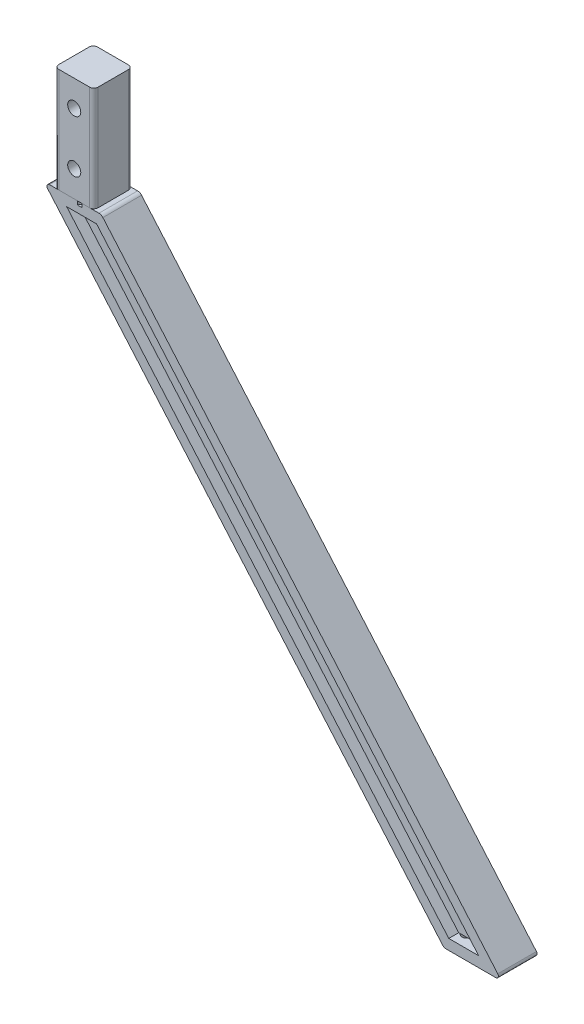
ISO-10303-21;
HEADER;
FILE_DESCRIPTION(('STEP AP214'),'2;1');
FILE_NAME('part.step','',(''),(''),'','','');
FILE_SCHEMA(('AUTOMOTIVE_DESIGN { 1 0 10303 214 1 1 1 1 }'));
ENDSEC;
DATA;
#1=APPLICATION_CONTEXT('core data for automotive mechanical design processes');
#2=APPLICATION_PROTOCOL_DEFINITION('international standard','automotive_design',2000,#1);
#3=PRODUCT_CONTEXT('',#1,'mechanical');
#4=PRODUCT('Part','Part','',(#3));
#5=PRODUCT_RELATED_PRODUCT_CATEGORY('part','',(#4));
#6=PRODUCT_DEFINITION_FORMATION('','',#4);
#7=PRODUCT_DEFINITION_CONTEXT('part definition',#1,'design');
#8=PRODUCT_DEFINITION('design','',#6,#7);
#9=PRODUCT_DEFINITION_SHAPE('','',#8);
#10=(LENGTH_UNIT() NAMED_UNIT(*) SI_UNIT(.MILLI.,.METRE.));
#11=(NAMED_UNIT(*) PLANE_ANGLE_UNIT() SI_UNIT($,.RADIAN.));
#12=(NAMED_UNIT(*) SI_UNIT($,.STERADIAN.) SOLID_ANGLE_UNIT());
#13=UNCERTAINTY_MEASURE_WITH_UNIT(LENGTH_MEASURE(1.E-05),#10,'distance_accuracy_value','');
#14=(GEOMETRIC_REPRESENTATION_CONTEXT(3) GLOBAL_UNCERTAINTY_ASSIGNED_CONTEXT((#13)) GLOBAL_UNIT_ASSIGNED_CONTEXT((#10,
#11,#12)) REPRESENTATION_CONTEXT('',''));
#15=CARTESIAN_POINT('',(0.,0.,0.));
#16=DIRECTION('',(0.,0.,1.));
#17=DIRECTION('',(1.,0.,0.));
#18=AXIS2_PLACEMENT_3D('',#15,#16,#17);
#19=CARTESIAN_POINT('',(-172.203507981271,276.098,2.032));
#20=DIRECTION('',(0.,-1.,0.));
#21=DIRECTION('',(0.,0.,-1.));
#22=AXIS2_PLACEMENT_3D('',#19,#20,#21);
#23=CYLINDRICAL_SURFACE('',#22,2.032);
#24=CARTESIAN_POINT('',(-172.203507981271,225.298,2.032));
#25=DIRECTION('',(0.,1.,0.));
#26=DIRECTION('',(0.,0.,1.));
#27=AXIS2_PLACEMENT_3D('',#24,#25,#26);
#28=CIRCLE('',#27,2.032);
#29=CARTESIAN_POINT('',(-170.171507981271,225.298,2.03200000000001));
#30=VERTEX_POINT('',#29);
#31=CARTESIAN_POINT('',(-172.203507981271,225.298,0.));
#32=VERTEX_POINT('',#31);
#33=EDGE_CURVE('E145',#30,#32,#28,.T.);
#34=ORIENTED_EDGE('',*,*,#33,.T.);
#35=DIRECTION('',(0.,-1.,0.));
#36=VECTOR('',#35,1.);
#37=CARTESIAN_POINT('',(-172.203507981271,276.098,0.));
#38=LINE('',#37,#36);
#39=CARTESIAN_POINT('',(-172.203507981271,276.098,0.));
#40=VERTEX_POINT('',#39);
#41=EDGE_CURVE('E12',#40,#32,#38,.T.);
#42=ORIENTED_EDGE('',*,*,#41,.F.);
#43=CARTESIAN_POINT('',(-172.203507981271,276.098,2.032));
#44=DIRECTION('',(0.,1.,0.));
#45=DIRECTION('',(0.,0.,1.));
#46=AXIS2_PLACEMENT_3D('',#43,#44,#45);
#47=CIRCLE('',#46,2.032);
#48=CARTESIAN_POINT('',(-170.171507981271,276.098,2.03200000000001));
#49=VERTEX_POINT('',#48);
#50=EDGE_CURVE('E159',#49,#40,#47,.T.);
#51=ORIENTED_EDGE('',*,*,#50,.F.);
#52=DIRECTION('',(0.,-1.,0.));
#53=VECTOR('',#52,1.);
#54=CARTESIAN_POINT('',(-170.171507981271,276.098,2.03200000000001));
#55=LINE('',#54,#53);
#56=EDGE_CURVE('E141',#49,#30,#55,.T.);
#57=ORIENTED_EDGE('',*,*,#56,.T.);
#58=EDGE_LOOP('',(#34,#42,#51,#57));
#59=FACE_BOUND('',#58,.T.);
#60=ADVANCED_FACE('F47',(#59),#23,.T.);
#61=CARTESIAN_POINT('',(-187.189507981271,276.098,0.));
#62=DIRECTION('',(0.,0.,1.));
#63=DIRECTION('',(1.,0.,0.));
#64=AXIS2_PLACEMENT_3D('',#61,#62,#63);
#65=PLANE('',#64);
#66=CARTESIAN_POINT('',(-179.696507981271,237.998,0.));
#67=DIRECTION('',(0.,0.,1.));
#68=DIRECTION('',(1.,0.,0.));
#69=AXIS2_PLACEMENT_3D('',#66,#67,#68);
#70=CIRCLE('',#69,3.175);
#71=CARTESIAN_POINT('',(-176.521507981271,237.998,0.));
#72=VERTEX_POINT('',#71);
#73=EDGE_CURVE('E172',#72,#72,#70,.T.);
#74=ORIENTED_EDGE('',*,*,#73,.T.);
#75=EDGE_LOOP('',(#74));
#76=FACE_BOUND('',#75,.T.);
#77=CARTESIAN_POINT('',(-179.696507981271,263.398,0.));
#78=DIRECTION('',(0.,0.,1.));
#79=DIRECTION('',(1.,0.,0.));
#80=AXIS2_PLACEMENT_3D('',#77,#78,#79);
#81=CIRCLE('',#80,3.175);
#82=CARTESIAN_POINT('',(-176.521507981271,263.398,0.));
#83=VERTEX_POINT('',#82);
#84=EDGE_CURVE('E177',#83,#83,#81,.T.);
#85=ORIENTED_EDGE('',*,*,#84,.T.);
#86=EDGE_LOOP('',(#85));
#87=FACE_BOUND('',#86,.T.);
#88=DIRECTION('',(-1.,0.,0.));
#89=VECTOR('',#88,1.);
#90=CARTESIAN_POINT('',(-187.189507981271,225.298,0.));
#91=LINE('',#90,#89);
#92=CARTESIAN_POINT('',(-187.189507981271,225.298,0.));
#93=VERTEX_POINT('',#92);
#94=EDGE_CURVE('E148',#32,#93,#91,.T.);
#95=ORIENTED_EDGE('',*,*,#94,.T.);
#96=DIRECTION('',(0.,-1.,0.));
#97=VECTOR('',#96,1.);
#98=CARTESIAN_POINT('',(-187.189507981271,276.098,0.));
#99=LINE('',#98,#97);
#100=CARTESIAN_POINT('',(-187.189507981271,276.098,0.));
#101=VERTEX_POINT('',#100);
#102=EDGE_CURVE('E56',#101,#93,#99,.T.);
#103=ORIENTED_EDGE('',*,*,#102,.F.);
#104=DIRECTION('',(-1.,0.,0.));
#105=VECTOR('',#104,1.);
#106=CARTESIAN_POINT('',(-187.189507981271,276.098,0.));
#107=LINE('',#106,#105);
#108=EDGE_CURVE('E108',#40,#101,#107,.T.);
#109=ORIENTED_EDGE('',*,*,#108,.F.);
#110=ORIENTED_EDGE('',*,*,#41,.T.);
#111=EDGE_LOOP('',(#95,#103,#109,#110));
#112=FACE_BOUND('',#111,.T.);
#113=ADVANCED_FACE('F217',(#76,#87,#112),#65,.F.);
#114=CARTESIAN_POINT('',(-187.189507981271,276.098,2.032));
#115=DIRECTION('',(0.,-1.,0.));
#116=DIRECTION('',(0.,0.,-1.));
#117=AXIS2_PLACEMENT_3D('',#114,#115,#116);
#118=CYLINDRICAL_SURFACE('',#117,2.032);
#119=CARTESIAN_POINT('',(-187.189507981271,225.298,2.032));
#120=DIRECTION('',(0.,1.,0.));
#121=DIRECTION('',(0.,0.,-1.));
#122=AXIS2_PLACEMENT_3D('',#119,#120,#121);
#123=CIRCLE('',#122,2.032);
#124=CARTESIAN_POINT('',(-189.221507981271,225.298,2.03200000000001));
#125=VERTEX_POINT('',#124);
#126=EDGE_CURVE('E150',#93,#125,#123,.T.);
#127=ORIENTED_EDGE('',*,*,#126,.T.);
#128=DIRECTION('',(0.,-1.,0.));
#129=VECTOR('',#128,1.);
#130=CARTESIAN_POINT('',(-189.221507981271,276.098,2.03200000000001));
#131=LINE('',#130,#129);
#132=CARTESIAN_POINT('',(-189.221507981271,276.098,2.03200000000001));
#133=VERTEX_POINT('',#132);
#134=EDGE_CURVE('E166',#133,#125,#131,.T.);
#135=ORIENTED_EDGE('',*,*,#134,.F.);
#136=CARTESIAN_POINT('',(-187.189507981271,276.098,2.032));
#137=DIRECTION('',(0.,1.,0.));
#138=DIRECTION('',(0.,0.,-1.));
#139=AXIS2_PLACEMENT_3D('',#136,#137,#138);
#140=CIRCLE('',#139,2.032);
#141=EDGE_CURVE('E186',#101,#133,#140,.T.);
#142=ORIENTED_EDGE('',*,*,#141,.F.);
#143=ORIENTED_EDGE('',*,*,#102,.T.);
#144=EDGE_LOOP('',(#127,#135,#142,#143));
#145=FACE_BOUND('',#144,.T.);
#146=ADVANCED_FACE('F221',(#145),#118,.T.);
#147=CARTESIAN_POINT('',(-189.221507981271,276.098,2.03200000000001));
#148=DIRECTION('',(1.,0.,0.));
#149=DIRECTION('',(0.,0.,-1.));
#150=AXIS2_PLACEMENT_3D('',#147,#148,#149);
#151=PLANE('',#150);
#152=DIRECTION('',(0.,0.,1.));
#153=VECTOR('',#152,1.);
#154=CARTESIAN_POINT('',(-189.221507981271,225.298,2.03200000000001));
#155=LINE('',#154,#153);
#156=CARTESIAN_POINT('',(-189.221507981271,225.298,16.764));
#157=VERTEX_POINT('',#156);
#158=EDGE_CURVE('E152',#125,#157,#155,.T.);
#159=ORIENTED_EDGE('',*,*,#158,.T.);
#160=DIRECTION('',(0.,-1.,0.));
#161=VECTOR('',#160,1.);
#162=CARTESIAN_POINT('',(-189.221507981271,276.098,16.764));
#163=LINE('',#162,#161);
#164=CARTESIAN_POINT('',(-189.221507981271,276.098,16.764));
#165=VERTEX_POINT('',#164);
#166=EDGE_CURVE('E163',#165,#157,#163,.T.);
#167=ORIENTED_EDGE('',*,*,#166,.F.);
#168=DIRECTION('',(0.,0.,1.));
#169=VECTOR('',#168,1.);
#170=CARTESIAN_POINT('',(-189.221507981271,276.098,2.03200000000001));
#171=LINE('',#170,#169);
#172=EDGE_CURVE('E188',#133,#165,#171,.T.);
#173=ORIENTED_EDGE('',*,*,#172,.F.);
#174=ORIENTED_EDGE('',*,*,#134,.T.);
#175=EDGE_LOOP('',(#159,#167,#173,#174));
#176=FACE_BOUND('',#175,.T.);
#177=ADVANCED_FACE('F194',(#176),#151,.F.);
#178=CARTESIAN_POINT('',(-187.189507981271,276.098,16.764));
#179=DIRECTION('',(0.,-1.,0.));
#180=DIRECTION('',(0.,0.,-1.));
#181=AXIS2_PLACEMENT_3D('',#178,#179,#180);
#182=CYLINDRICAL_SURFACE('',#181,2.032);
#183=CARTESIAN_POINT('',(-187.189507981271,225.298,16.764));
#184=DIRECTION('',(0.,1.,0.));
#185=DIRECTION('',(0.,0.,1.));
#186=AXIS2_PLACEMENT_3D('',#183,#184,#185);
#187=CIRCLE('',#186,2.032);
#188=CARTESIAN_POINT('',(-187.189507981271,225.298,18.796));
#189=VERTEX_POINT('',#188);
#190=EDGE_CURVE('E154',#157,#189,#187,.T.);
#191=ORIENTED_EDGE('',*,*,#190,.T.);
#192=DIRECTION('',(0.,-1.,0.));
#193=VECTOR('',#192,1.);
#194=CARTESIAN_POINT('',(-187.189507981271,276.098,18.796));
#195=LINE('',#194,#193);
#196=CARTESIAN_POINT('',(-187.189507981271,276.098,18.796));
#197=VERTEX_POINT('',#196);
#198=EDGE_CURVE('E136',#197,#189,#195,.T.);
#199=ORIENTED_EDGE('',*,*,#198,.F.);
#200=CARTESIAN_POINT('',(-187.189507981271,276.098,16.764));
#201=DIRECTION('',(0.,1.,0.));
#202=DIRECTION('',(0.,0.,1.));
#203=AXIS2_PLACEMENT_3D('',#200,#201,#202);
#204=CIRCLE('',#203,2.032);
#205=EDGE_CURVE('E127',#165,#197,#204,.T.);
#206=ORIENTED_EDGE('',*,*,#205,.F.);
#207=ORIENTED_EDGE('',*,*,#166,.T.);
#208=EDGE_LOOP('',(#191,#199,#206,#207));
#209=FACE_BOUND('',#208,.T.);
#210=ADVANCED_FACE('F198',(#209),#182,.T.);
#211=CARTESIAN_POINT('',(-187.189507981271,276.098,18.796));
#212=DIRECTION('',(0.,0.,-1.));
#213=DIRECTION('',(-1.,0.,0.));
#214=AXIS2_PLACEMENT_3D('',#211,#212,#213);
#215=PLANE('',#214);
#216=CARTESIAN_POINT('',(-179.696507981271,237.998,18.796));
#217=DIRECTION('',(0.,0.,-1.));
#218=DIRECTION('',(-1.,0.,0.));
#219=AXIS2_PLACEMENT_3D('',#216,#217,#218);
#220=CIRCLE('',#219,3.175);
#221=CARTESIAN_POINT('',(-182.871507981271,237.998,18.796));
#222=VERTEX_POINT('',#221);
#223=EDGE_CURVE('E50',#222,#222,#220,.T.);
#224=ORIENTED_EDGE('',*,*,#223,.T.);
#225=EDGE_LOOP('',(#224));
#226=FACE_BOUND('',#225,.T.);
#227=CARTESIAN_POINT('',(-179.696507981271,263.398,18.796));
#228=DIRECTION('',(0.,0.,-1.));
#229=DIRECTION('',(-1.,0.,0.));
#230=AXIS2_PLACEMENT_3D('',#227,#228,#229);
#231=CIRCLE('',#230,3.175);
#232=CARTESIAN_POINT('',(-182.871507981271,263.398,18.796));
#233=VERTEX_POINT('',#232);
#234=EDGE_CURVE('E170',#233,#233,#231,.T.);
#235=ORIENTED_EDGE('',*,*,#234,.T.);
#236=EDGE_LOOP('',(#235));
#237=FACE_BOUND('',#236,.T.);
#238=DIRECTION('',(1.,0.,0.));
#239=VECTOR('',#238,1.);
#240=CARTESIAN_POINT('',(-187.189507981271,225.298,18.796));
#241=LINE('',#240,#239);
#242=CARTESIAN_POINT('',(-172.203507981271,225.298,18.796));
#243=VERTEX_POINT('',#242);
#244=EDGE_CURVE('E135',#189,#243,#241,.T.);
#245=ORIENTED_EDGE('',*,*,#244,.T.);
#246=DIRECTION('',(0.,-1.,0.));
#247=VECTOR('',#246,1.);
#248=CARTESIAN_POINT('',(-172.203507981271,276.098,18.796));
#249=LINE('',#248,#247);
#250=CARTESIAN_POINT('',(-172.203507981271,276.098,18.796));
#251=VERTEX_POINT('',#250);
#252=EDGE_CURVE('E132',#251,#243,#249,.T.);
#253=ORIENTED_EDGE('',*,*,#252,.F.);
#254=DIRECTION('',(1.,0.,0.));
#255=VECTOR('',#254,1.);
#256=CARTESIAN_POINT('',(-187.189507981271,276.098,18.796));
#257=LINE('',#256,#255);
#258=EDGE_CURVE('E121',#197,#251,#257,.T.);
#259=ORIENTED_EDGE('',*,*,#258,.F.);
#260=ORIENTED_EDGE('',*,*,#198,.T.);
#261=EDGE_LOOP('',(#245,#253,#259,#260));
#262=FACE_BOUND('',#261,.T.);
#263=ADVANCED_FACE('F133',(#226,#237,#262),#215,.F.);
#264=CARTESIAN_POINT('',(-172.203507981271,276.098,16.764));
#265=DIRECTION('',(0.,-1.,0.));
#266=DIRECTION('',(0.,0.,-1.));
#267=AXIS2_PLACEMENT_3D('',#264,#265,#266);
#268=CYLINDRICAL_SURFACE('',#267,2.032);
#269=CARTESIAN_POINT('',(-172.203507981271,225.298,16.764));
#270=DIRECTION('',(0.,1.,0.));
#271=DIRECTION('',(0.,0.,1.));
#272=AXIS2_PLACEMENT_3D('',#269,#270,#271);
#273=CIRCLE('',#272,2.032);
#274=CARTESIAN_POINT('',(-170.171507981271,225.298,16.764));
#275=VERTEX_POINT('',#274);
#276=EDGE_CURVE('E94',#243,#275,#273,.T.);
#277=ORIENTED_EDGE('',*,*,#276,.T.);
#278=DIRECTION('',(0.,-1.,0.));
#279=VECTOR('',#278,1.);
#280=CARTESIAN_POINT('',(-170.171507981271,276.098,16.764));
#281=LINE('',#280,#279);
#282=CARTESIAN_POINT('',(-170.171507981271,276.098,16.764));
#283=VERTEX_POINT('',#282);
#284=EDGE_CURVE('E137',#283,#275,#281,.T.);
#285=ORIENTED_EDGE('',*,*,#284,.F.);
#286=CARTESIAN_POINT('',(-172.203507981271,276.098,16.764));
#287=DIRECTION('',(0.,1.,0.));
#288=DIRECTION('',(0.,0.,1.));
#289=AXIS2_PLACEMENT_3D('',#286,#287,#288);
#290=CIRCLE('',#289,2.032);
#291=EDGE_CURVE('E125',#251,#283,#290,.T.);
#292=ORIENTED_EDGE('',*,*,#291,.F.);
#293=ORIENTED_EDGE('',*,*,#252,.T.);
#294=EDGE_LOOP('',(#277,#285,#292,#293));
#295=FACE_BOUND('',#294,.T.);
#296=ADVANCED_FACE('F139',(#295),#268,.T.);
#297=CARTESIAN_POINT('',(-170.171507981271,276.098,2.03200000000001));
#298=DIRECTION('',(-1.,0.,0.));
#299=DIRECTION('',(0.,0.,1.));
#300=AXIS2_PLACEMENT_3D('',#297,#298,#299);
#301=PLANE('',#300);
#302=DIRECTION('',(0.,0.,-1.));
#303=VECTOR('',#302,1.);
#304=CARTESIAN_POINT('',(-170.171507981271,225.298,2.03200000000001));
#305=LINE('',#304,#303);
#306=EDGE_CURVE('E100',#275,#30,#305,.T.);
#307=ORIENTED_EDGE('',*,*,#306,.T.);
#308=ORIENTED_EDGE('',*,*,#56,.F.);
#309=DIRECTION('',(0.,0.,-1.));
#310=VECTOR('',#309,1.);
#311=CARTESIAN_POINT('',(-170.171507981271,276.098,2.03200000000001));
#312=LINE('',#311,#310);
#313=EDGE_CURVE('E65',#283,#49,#312,.T.);
#314=ORIENTED_EDGE('',*,*,#313,.F.);
#315=ORIENTED_EDGE('',*,*,#284,.T.);
#316=EDGE_LOOP('',(#307,#308,#314,#315));
#317=FACE_BOUND('',#316,.T.);
#318=ADVANCED_FACE('F206',(#317),#301,.F.);
#319=CARTESIAN_POINT('',(-172.203507981271,276.098,2.032));
#320=DIRECTION('',(0.,1.,0.));
#321=DIRECTION('',(0.,0.,1.));
#322=AXIS2_PLACEMENT_3D('',#319,#320,#321);
#323=PLANE('',#322);
#324=ORIENTED_EDGE('',*,*,#50,.T.);
#325=ORIENTED_EDGE('',*,*,#108,.T.);
#326=ORIENTED_EDGE('',*,*,#141,.T.);
#327=ORIENTED_EDGE('',*,*,#172,.T.);
#328=ORIENTED_EDGE('',*,*,#205,.T.);
#329=ORIENTED_EDGE('',*,*,#258,.T.);
#330=ORIENTED_EDGE('',*,*,#291,.T.);
#331=ORIENTED_EDGE('',*,*,#313,.T.);
#332=EDGE_LOOP('',(#324,#325,#326,#327,#328,#329,#330,#331));
#333=FACE_BOUND('',#332,.T.);
#334=ADVANCED_FACE('F123',(#333),#323,.T.);
#335=CARTESIAN_POINT('',(-172.203507981271,225.298,2.032));
#336=DIRECTION('',(0.,1.,0.));
#337=DIRECTION('',(0.,0.,1.));
#338=AXIS2_PLACEMENT_3D('',#335,#336,#337);
#339=PLANE('',#338);
#340=ORIENTED_EDGE('',*,*,#33,.F.);
#341=ORIENTED_EDGE('',*,*,#306,.F.);
#342=ORIENTED_EDGE('',*,*,#276,.F.);
#343=ORIENTED_EDGE('',*,*,#244,.F.);
#344=ORIENTED_EDGE('',*,*,#190,.F.);
#345=ORIENTED_EDGE('',*,*,#158,.F.);
#346=ORIENTED_EDGE('',*,*,#126,.F.);
#347=ORIENTED_EDGE('',*,*,#94,.F.);
#348=EDGE_LOOP('',(#340,#341,#342,#343,#344,#345,#346,#347));
#349=FACE_BOUND('',#348,.T.);
#350=ADVANCED_FACE('F201',(#349),#339,.F.);
#351=CARTESIAN_POINT('',(-179.696507981271,263.398,0.));
#352=DIRECTION('',(0.,0.,1.));
#353=DIRECTION('',(1.,0.,0.));
#354=AXIS2_PLACEMENT_3D('',#351,#352,#353);
#355=CYLINDRICAL_SURFACE('',#354,3.175);
#356=ORIENTED_EDGE('',*,*,#84,.F.);
#357=EDGE_LOOP('',(#356));
#358=FACE_BOUND('',#357,.T.);
#359=ORIENTED_EDGE('',*,*,#234,.F.);
#360=EDGE_LOOP('',(#359));
#361=FACE_BOUND('',#360,.T.);
#362=ADVANCED_FACE('F241',(#358,#361),#355,.F.);
#363=CARTESIAN_POINT('',(-179.696507981271,237.998,0.));
#364=DIRECTION('',(0.,0.,1.));
#365=DIRECTION('',(1.,0.,0.));
#366=AXIS2_PLACEMENT_3D('',#363,#364,#365);
#367=CYLINDRICAL_SURFACE('',#366,3.175);
#368=ORIENTED_EDGE('',*,*,#73,.F.);
#369=EDGE_LOOP('',(#368));
#370=FACE_BOUND('',#369,.T.);
#371=ORIENTED_EDGE('',*,*,#223,.F.);
#372=EDGE_LOOP('',(#371));
#373=FACE_BOUND('',#372,.T.);
#374=ADVANCED_FACE('F239',(#370,#373),#367,.F.);
#375=CLOSED_SHELL('',(#60,#113,#146,#177,#210,#263,#296,#318,#334,#350,#362,#374));
#376=MANIFOLD_SOLID_BREP('B2',#375);
#377=CARTESIAN_POINT('',(-191.698096291734,224.028,18.796));
#378=DIRECTION('',(0.,0.,-1.));
#379=DIRECTION('',(-1.,0.,0.));
#380=AXIS2_PLACEMENT_3D('',#377,#378,#379);
#381=CYLINDRICAL_SURFACE('',#380,1.27000000000001);
#382=CARTESIAN_POINT('',(-191.698096291734,224.028,0.));
#383=DIRECTION('',(0.,0.,1.));
#384=DIRECTION('',(-1.,0.,0.));
#385=AXIS2_PLACEMENT_3D('',#382,#383,#384);
#386=CIRCLE('',#385,1.27000000000001);
#387=CARTESIAN_POINT('',(-191.698096291734,225.298,0.));
#388=VERTEX_POINT('',#387);
#389=CARTESIAN_POINT('',(-192.659480012412,223.198155832933,0.));
#390=VERTEX_POINT('',#389);
#391=EDGE_CURVE('E601',#388,#390,#386,.T.);
#392=ORIENTED_EDGE('',*,*,#391,.T.);
#393=DIRECTION('',(0.,0.,-1.));
#394=VECTOR('',#393,1.);
#395=CARTESIAN_POINT('',(-192.659480012412,223.198155832933,18.796));
#396=LINE('',#395,#394);
#397=CARTESIAN_POINT('',(-192.659480012412,223.198155832933,18.796));
#398=VERTEX_POINT('',#397);
#399=EDGE_CURVE('E604',#398,#390,#396,.T.);
#400=ORIENTED_EDGE('',*,*,#399,.F.);
#401=CARTESIAN_POINT('',(-191.698096291734,224.028,18.796));
#402=DIRECTION('',(0.,0.,1.));
#403=DIRECTION('',(-1.,0.,0.));
#404=AXIS2_PLACEMENT_3D('',#401,#402,#403);
#405=CIRCLE('',#404,1.27000000000001);
#406=CARTESIAN_POINT('',(-191.698096291734,225.298,18.796));
#407=VERTEX_POINT('',#406);
#408=EDGE_CURVE('E633',#407,#398,#405,.T.);
#409=ORIENTED_EDGE('',*,*,#408,.F.);
#410=DIRECTION('',(0.,0.,-1.));
#411=VECTOR('',#410,1.);
#412=CARTESIAN_POINT('',(-191.698096291734,225.298,18.796));
#413=LINE('',#412,#411);
#414=EDGE_CURVE('E606',#407,#388,#413,.T.);
#415=ORIENTED_EDGE('',*,*,#414,.T.);
#416=EDGE_LOOP('',(#392,#400,#409,#415));
#417=FACE_BOUND('',#416,.T.);
#418=ADVANCED_FACE('F316',(#417),#381,.T.);
#419=CARTESIAN_POINT('',(-0.759864646558204,0.880311665865122,18.796));
#420=DIRECTION('',(0.756995055651753,0.65342060399011,0.));
#421=DIRECTION('',(-0.65342060399011,0.756995055651753,0.));
#422=AXIS2_PLACEMENT_3D('',#419,#420,#421);
#423=PLANE('',#422);
#424=DIRECTION('',(0.65342060399011,-0.756995055651753,0.));
#425=VECTOR('',#424,1.);
#426=CARTESIAN_POINT('',(-0.759864646558204,0.880311665865122,0.));
#427=LINE('',#426,#425);
#428=CARTESIAN_POINT('',(-0.759864646558204,0.880311665865122,0.));
#429=VERTEX_POINT('',#428);
#430=EDGE_CURVE('E609',#390,#429,#427,.T.);
#431=ORIENTED_EDGE('',*,*,#430,.T.);
#432=DIRECTION('',(0.,0.,-1.));
#433=VECTOR('',#432,1.);
#434=CARTESIAN_POINT('',(-0.759864646558204,0.880311665865122,18.796));
#435=LINE('',#434,#433);
#436=CARTESIAN_POINT('',(-0.759864646558204,0.880311665865122,18.796));
#437=VERTEX_POINT('',#436);
#438=EDGE_CURVE('E650',#437,#429,#435,.T.);
#439=ORIENTED_EDGE('',*,*,#438,.F.);
#440=DIRECTION('',(0.65342060399011,-0.756995055651753,0.));
#441=VECTOR('',#440,1.);
#442=CARTESIAN_POINT('',(-0.759864646558204,0.880311665865122,18.796));
#443=LINE('',#442,#441);
#444=EDGE_CURVE('E688',#398,#437,#443,.T.);
#445=ORIENTED_EDGE('',*,*,#444,.F.);
#446=ORIENTED_EDGE('',*,*,#399,.T.);
#447=EDGE_LOOP('',(#431,#439,#445,#446));
#448=FACE_BOUND('',#447,.T.);
#449=ADVANCED_FACE('F590',(#448),#423,.F.);
#450=CARTESIAN_POINT('',(1.16290279479725,2.54,18.796));
#451=DIRECTION('',(0.,0.,-1.));
#452=DIRECTION('',(-1.,0.,0.));
#453=AXIS2_PLACEMENT_3D('',#450,#451,#452);
#454=CYLINDRICAL_SURFACE('',#453,2.54);
#455=CARTESIAN_POINT('',(1.16290279479725,2.54,0.));
#456=DIRECTION('',(0.,0.,1.));
#457=DIRECTION('',(-1.,0.,0.));
#458=AXIS2_PLACEMENT_3D('',#455,#456,#457);
#459=CIRCLE('',#458,2.54);
#460=CARTESIAN_POINT('',(1.16290279479725,0.,0.));
#461=VERTEX_POINT('',#460);
#462=EDGE_CURVE('E612',#429,#461,#459,.T.);
#463=ORIENTED_EDGE('',*,*,#462,.T.);
#464=DIRECTION('',(0.,0.,-1.));
#465=VECTOR('',#464,1.);
#466=CARTESIAN_POINT('',(1.16290279479725,0.,18.796));
#467=LINE('',#466,#465);
#468=CARTESIAN_POINT('',(1.16290279479725,0.,18.796));
#469=VERTEX_POINT('',#468);
#470=EDGE_CURVE('E647',#469,#461,#467,.T.);
#471=ORIENTED_EDGE('',*,*,#470,.F.);
#472=CARTESIAN_POINT('',(1.16290279479725,2.54,18.796));
#473=DIRECTION('',(0.,0.,1.));
#474=DIRECTION('',(-1.,0.,0.));
#475=AXIS2_PLACEMENT_3D('',#472,#473,#474);
#476=CIRCLE('',#475,2.54);
#477=EDGE_CURVE('E686',#437,#469,#476,.T.);
#478=ORIENTED_EDGE('',*,*,#477,.F.);
#479=ORIENTED_EDGE('',*,*,#438,.T.);
#480=EDGE_LOOP('',(#463,#471,#478,#479));
#481=FACE_BOUND('',#480,.T.);
#482=ADVANCED_FACE('F595',(#481),#454,.T.);
#483=CARTESIAN_POINT('',(1.16290279479725,0.,18.796));
#484=DIRECTION('',(0.,1.,0.));
#485=DIRECTION('',(0.,0.,1.));
#486=AXIS2_PLACEMENT_3D('',#483,#484,#485);
#487=PLANE('',#486);
#488=CARTESIAN_POINT('',(4.9931091931181,0.,12.7));
#489=DIRECTION('',(0.,1.,0.));
#490=DIRECTION('',(0.,0.,1.));
#491=AXIS2_PLACEMENT_3D('',#488,#489,#490);
#492=CIRCLE('',#491,2.286);
#493=CARTESIAN_POINT('',(4.9931091931181,0.,14.986));
#494=VERTEX_POINT('',#493);
#495=EDGE_CURVE('E502',#494,#494,#492,.T.);
#496=ORIENTED_EDGE('',*,*,#495,.T.);
#497=EDGE_LOOP('',(#496));
#498=FACE_BOUND('',#497,.T.);
#499=CARTESIAN_POINT('',(4.9931091931181,0.,6.09599999999995));
#500=DIRECTION('',(0.,1.,0.));
#501=DIRECTION('',(0.,0.,-1.));
#502=AXIS2_PLACEMENT_3D('',#499,#500,#501);
#503=CIRCLE('',#502,2.286);
#504=CARTESIAN_POINT('',(4.9931091931181,0.,3.80999999999995));
#505=VERTEX_POINT('',#504);
#506=EDGE_CURVE('E474',#505,#505,#503,.T.);
#507=ORIENTED_EDGE('',*,*,#506,.T.);
#508=EDGE_LOOP('',(#507));
#509=FACE_BOUND('',#508,.T.);
#510=DIRECTION('',(1.,0.,0.));
#511=VECTOR('',#510,1.);
#512=CARTESIAN_POINT('',(1.16290279479725,0.,0.));
#513=LINE('',#512,#511);
#514=CARTESIAN_POINT('',(25.1660794157242,0.,0.));
#515=VERTEX_POINT('',#514);
#516=EDGE_CURVE('E621',#461,#515,#513,.T.);
#517=ORIENTED_EDGE('',*,*,#516,.T.);
#518=DIRECTION('',(0.,0.,-1.));
#519=VECTOR('',#518,1.);
#520=CARTESIAN_POINT('',(25.1660794157242,0.,18.796));
#521=LINE('',#520,#519);
#522=CARTESIAN_POINT('',(25.1660794157242,0.,18.796));
#523=VERTEX_POINT('',#522);
#524=EDGE_CURVE('E644',#523,#515,#521,.T.);
#525=ORIENTED_EDGE('',*,*,#524,.F.);
#526=DIRECTION('',(1.,0.,0.));
#527=VECTOR('',#526,1.);
#528=CARTESIAN_POINT('',(1.16290279479725,0.,18.796));
#529=LINE('',#528,#527);
#530=EDGE_CURVE('E684',#469,#523,#529,.T.);
#531=ORIENTED_EDGE('',*,*,#530,.F.);
#532=ORIENTED_EDGE('',*,*,#470,.T.);
#533=EDGE_LOOP('',(#517,#525,#531,#532));
#534=FACE_BOUND('',#533,.T.);
#535=ADVANCED_FACE('F519',(#498,#509,#534),#487,.F.);
#536=CARTESIAN_POINT('',(25.1660794157242,1.27,18.796));
#537=DIRECTION('',(0.,0.,-1.));
#538=DIRECTION('',(-1.,0.,0.));
#539=AXIS2_PLACEMENT_3D('',#536,#537,#538);
#540=CYLINDRICAL_SURFACE('',#539,1.27);
#541=CARTESIAN_POINT('',(25.1660794157242,1.27,0.));
#542=DIRECTION('',(0.,0.,1.));
#543=DIRECTION('',(1.,0.,0.));
#544=AXIS2_PLACEMENT_3D('',#541,#542,#543);
#545=CIRCLE('',#544,1.27);
#546=CARTESIAN_POINT('',(26.1274631364019,2.09984416706744,0.));
#547=VERTEX_POINT('',#546);
#548=EDGE_CURVE('E623',#515,#547,#545,.T.);
#549=ORIENTED_EDGE('',*,*,#548,.T.);
#550=DIRECTION('',(0.,0.,-1.));
#551=VECTOR('',#550,1.);
#552=CARTESIAN_POINT('',(26.1274631364019,2.09984416706744,18.796));
#553=LINE('',#552,#551);
#554=CARTESIAN_POINT('',(26.1274631364019,2.09984416706744,18.796));
#555=VERTEX_POINT('',#554);
#556=EDGE_CURVE('E641',#555,#547,#553,.T.);
#557=ORIENTED_EDGE('',*,*,#556,.F.);
#558=CARTESIAN_POINT('',(25.1660794157242,1.27,18.796));
#559=DIRECTION('',(0.,0.,1.));
#560=DIRECTION('',(1.,0.,0.));
#561=AXIS2_PLACEMENT_3D('',#558,#559,#560);
#562=CIRCLE('',#561,1.27);
#563=EDGE_CURVE('E680',#523,#555,#562,.T.);
#564=ORIENTED_EDGE('',*,*,#563,.F.);
#565=ORIENTED_EDGE('',*,*,#524,.T.);
#566=EDGE_LOOP('',(#549,#557,#564,#565));
#567=FACE_BOUND('',#566,.T.);
#568=ADVANCED_FACE('F742',(#567),#540,.T.);
#569=CARTESIAN_POINT('',(26.1274631364019,2.09984416706744,18.796));
#570=DIRECTION('',(-0.756995055651753,-0.65342060399011,0.));
#571=DIRECTION('',(0.65342060399011,-0.756995055651753,0.));
#572=AXIS2_PLACEMENT_3D('',#569,#570,#571);
#573=PLANE('',#572);
#574=DIRECTION('',(-0.65342060399011,0.756995055651753,0.));
#575=VECTOR('',#574,1.);
#576=CARTESIAN_POINT('',(26.1274631364019,2.09984416706744,0.));
#577=LINE('',#576,#575);
#578=CARTESIAN_POINT('',(-165.772152229452,224.417688334135,0.));
#579=VERTEX_POINT('',#578);
#580=EDGE_CURVE('E625',#547,#579,#577,.T.);
#581=ORIENTED_EDGE('',*,*,#580,.T.);
#582=DIRECTION('',(0.,0.,-1.));
#583=VECTOR('',#582,1.);
#584=CARTESIAN_POINT('',(-165.772152229452,224.417688334135,18.796));
#585=LINE('',#584,#583);
#586=CARTESIAN_POINT('',(-165.772152229452,224.417688334135,18.796));
#587=VERTEX_POINT('',#586);
#588=EDGE_CURVE('E638',#587,#579,#585,.T.);
#589=ORIENTED_EDGE('',*,*,#588,.F.);
#590=DIRECTION('',(-0.65342060399011,0.756995055651753,0.));
#591=VECTOR('',#590,1.);
#592=CARTESIAN_POINT('',(26.1274631364019,2.09984416706744,18.796));
#593=LINE('',#592,#591);
#594=EDGE_CURVE('E677',#555,#587,#593,.T.);
#595=ORIENTED_EDGE('',*,*,#594,.F.);
#596=ORIENTED_EDGE('',*,*,#556,.T.);
#597=EDGE_LOOP('',(#581,#589,#595,#596));
#598=FACE_BOUND('',#597,.T.);
#599=ADVANCED_FACE('F738',(#598),#573,.F.);
#600=CARTESIAN_POINT('',(-167.694919670807,222.758,18.796));
#601=DIRECTION('',(0.,0.,-1.));
#602=DIRECTION('',(-1.,0.,0.));
#603=AXIS2_PLACEMENT_3D('',#600,#601,#602);
#604=CYLINDRICAL_SURFACE('',#603,2.53999999999998);
#605=CARTESIAN_POINT('',(-167.694919670807,222.758,0.));
#606=DIRECTION('',(0.,0.,1.));
#607=DIRECTION('',(1.,0.,0.));
#608=AXIS2_PLACEMENT_3D('',#605,#606,#607);
#609=CIRCLE('',#608,2.53999999999998);
#610=CARTESIAN_POINT('',(-167.694919670807,225.298,0.));
#611=VERTEX_POINT('',#610);
#612=EDGE_CURVE('E627',#579,#611,#609,.T.);
#613=ORIENTED_EDGE('',*,*,#612,.T.);
#614=DIRECTION('',(0.,0.,-1.));
#615=VECTOR('',#614,1.);
#616=CARTESIAN_POINT('',(-167.694919670807,225.298,18.796));
#617=LINE('',#616,#615);
#618=CARTESIAN_POINT('',(-167.694919670807,225.298,18.796));
#619=VERTEX_POINT('',#618);
#620=EDGE_CURVE('E635',#619,#611,#617,.T.);
#621=ORIENTED_EDGE('',*,*,#620,.F.);
#622=CARTESIAN_POINT('',(-167.694919670807,222.758,18.796));
#623=DIRECTION('',(0.,0.,1.));
#624=DIRECTION('',(1.,0.,0.));
#625=AXIS2_PLACEMENT_3D('',#622,#623,#624);
#626=CIRCLE('',#625,2.53999999999998);
#627=EDGE_CURVE('E676',#587,#619,#626,.T.);
#628=ORIENTED_EDGE('',*,*,#627,.F.);
#629=ORIENTED_EDGE('',*,*,#588,.T.);
#630=EDGE_LOOP('',(#613,#621,#628,#629));
#631=FACE_BOUND('',#630,.T.);
#632=ADVANCED_FACE('F735',(#631),#604,.T.);
#633=CARTESIAN_POINT('',(-167.694919670807,225.298,18.796));
#634=DIRECTION('',(0.,-1.,0.));
#635=DIRECTION('',(0.,0.,-1.));
#636=AXIS2_PLACEMENT_3D('',#633,#634,#635);
#637=PLANE('',#636);
#638=DIRECTION('',(-1.,0.,0.));
#639=VECTOR('',#638,1.);
#640=CARTESIAN_POINT('',(-167.694919670807,225.298,0.));
#641=LINE('',#640,#639);
#642=CARTESIAN_POINT('',(-175.805152229452,225.298,0.));
#643=VERTEX_POINT('',#642);
#644=EDGE_CURVE('E630',#611,#643,#641,.T.);
#645=ORIENTED_EDGE('',*,*,#644,.T.);
#646=CARTESIAN_POINT('',(-176.948152229452,225.298,0.));
#647=DIRECTION('',(0.,-1.,0.));
#648=DIRECTION('',(0.,0.,-1.));
#649=AXIS2_PLACEMENT_3D('',#646,#647,#648);
#650=CIRCLE('',#649,1.14300000000002);
#651=CARTESIAN_POINT('',(-178.091152229452,225.298,0.));
#652=VERTEX_POINT('',#651);
#653=EDGE_CURVE('E508',#643,#652,#650,.T.);
#654=ORIENTED_EDGE('',*,*,#653,.T.);
#655=EDGE_CURVE('E629',#652,#388,#641,.T.);
#656=ORIENTED_EDGE('',*,*,#655,.T.);
#657=ORIENTED_EDGE('',*,*,#414,.F.);
#658=DIRECTION('',(-1.,0.,0.));
#659=VECTOR('',#658,1.);
#660=CARTESIAN_POINT('',(-167.694919670807,225.298,18.796));
#661=LINE('',#660,#659);
#662=CARTESIAN_POINT('',(-178.091152229452,225.298,18.796));
#663=VERTEX_POINT('',#662);
#664=EDGE_CURVE('E671',#663,#407,#661,.T.);
#665=ORIENTED_EDGE('',*,*,#664,.F.);
#666=CARTESIAN_POINT('',(-176.948152229452,225.298,18.796));
#667=DIRECTION('',(0.,-1.,0.));
#668=DIRECTION('',(0.,0.,1.));
#669=AXIS2_PLACEMENT_3D('',#666,#667,#668);
#670=CIRCLE('',#669,1.14300000000002);
#671=CARTESIAN_POINT('',(-175.805152229452,225.298,18.796));
#672=VERTEX_POINT('',#671);
#673=EDGE_CURVE('E501',#663,#672,#670,.T.);
#674=ORIENTED_EDGE('',*,*,#673,.T.);
#675=EDGE_CURVE('E617',#619,#672,#661,.T.);
#676=ORIENTED_EDGE('',*,*,#675,.F.);
#677=ORIENTED_EDGE('',*,*,#620,.T.);
#678=EDGE_LOOP('',(#645,#654,#656,#657,#665,#674,#676,#677));
#679=FACE_BOUND('',#678,.T.);
#680=ADVANCED_FACE('F674',(#679),#637,.F.);
#681=CARTESIAN_POINT('',(-191.698096291734,224.028,18.796));
#682=DIRECTION('',(0.,0.,-1.));
#683=DIRECTION('',(-1.,0.,0.));
#684=AXIS2_PLACEMENT_3D('',#681,#682,#683);
#685=PLANE('',#684);
#686=ORIENTED_EDGE('',*,*,#675,.T.);
#687=DIRECTION('',(0.,-1.,0.));
#688=VECTOR('',#687,1.);
#689=CARTESIAN_POINT('',(-175.805152229452,225.298,18.796));
#690=LINE('',#689,#688);
#691=CARTESIAN_POINT('',(-175.805152229452,223.52,18.796));
#692=VERTEX_POINT('',#691);
#693=EDGE_CURVE('E45',#672,#692,#690,.T.);
#694=ORIENTED_EDGE('',*,*,#693,.T.);
#695=DIRECTION('',(1.,0.,0.));
#696=VECTOR('',#695,1.);
#697=CARTESIAN_POINT('',(-191.698096291734,223.52,18.796));
#698=LINE('',#697,#696);
#699=CARTESIAN_POINT('',(-178.091152229452,223.52,18.796));
#700=VERTEX_POINT('',#699);
#701=EDGE_CURVE('E661',#700,#692,#698,.T.);
#702=ORIENTED_EDGE('',*,*,#701,.F.);
#703=DIRECTION('',(0.,-1.,0.));
#704=VECTOR('',#703,1.);
#705=CARTESIAN_POINT('',(-178.091152229452,225.298,18.796));
#706=LINE('',#705,#704);
#707=EDGE_CURVE('E323',#700,#663,#706,.F.);
#708=ORIENTED_EDGE('',*,*,#707,.T.);
#709=ORIENTED_EDGE('',*,*,#664,.T.);
#710=ORIENTED_EDGE('',*,*,#408,.T.);
#711=ORIENTED_EDGE('',*,*,#444,.T.);
#712=ORIENTED_EDGE('',*,*,#477,.T.);
#713=ORIENTED_EDGE('',*,*,#530,.T.);
#714=ORIENTED_EDGE('',*,*,#563,.T.);
#715=ORIENTED_EDGE('',*,*,#594,.T.);
#716=ORIENTED_EDGE('',*,*,#627,.T.);
#717=EDGE_LOOP('',(#686,#694,#702,#708,#709,#710,#711,#712,#713,#714,#715,#716));
#718=FACE_BOUND('',#717,.T.);
#719=DIRECTION('',(0.65342060399011,-0.756995055651753,0.));
#720=VECTOR('',#719,1.);
#721=CARTESIAN_POINT('',(-183.376334538907,220.218,18.796));
#722=LINE('',#721,#720);
#723=CARTESIAN_POINT('',(-183.376334538907,220.218,18.796));
#724=VERTEX_POINT('',#723);
#725=CARTESIAN_POINT('',(2.32580558959451,5.08,18.796));
#726=VERTEX_POINT('',#725);
#727=EDGE_CURVE('E701',#724,#726,#722,.T.);
#728=ORIENTED_EDGE('',*,*,#727,.F.);
#729=DIRECTION('',(-1.,0.,0.));
#730=VECTOR('',#729,1.);
#731=CARTESIAN_POINT('',(-168.857822465604,220.218,18.796));
#732=LINE('',#731,#730);
#733=CARTESIAN_POINT('',(-168.857822465604,220.218,18.796));
#734=VERTEX_POINT('',#733);
#735=EDGE_CURVE('E559',#734,#724,#732,.T.);
#736=ORIENTED_EDGE('',*,*,#735,.F.);
#737=DIRECTION('',(-0.65342060399011,0.756995055651753,0.));
#738=VECTOR('',#737,1.);
#739=CARTESIAN_POINT('',(16.8443176628966,5.08,18.796));
#740=LINE('',#739,#738);
#741=CARTESIAN_POINT('',(16.8443176628966,5.08,18.796));
#742=VERTEX_POINT('',#741);
#743=EDGE_CURVE('E551',#742,#734,#740,.T.);
#744=ORIENTED_EDGE('',*,*,#743,.F.);
#745=DIRECTION('',(1.,0.,0.));
#746=VECTOR('',#745,1.);
#747=CARTESIAN_POINT('',(2.32580558959451,5.08,18.796));
#748=LINE('',#747,#746);
#749=EDGE_CURVE('E698',#726,#742,#748,.T.);
#750=ORIENTED_EDGE('',*,*,#749,.F.);
#751=EDGE_LOOP('',(#728,#736,#744,#750));
#752=FACE_BOUND('',#751,.T.);
#753=ADVANCED_FACE('F668',(#718,#752),#685,.F.);
#754=CARTESIAN_POINT('',(-191.698096291734,224.028,0.));
#755=DIRECTION('',(0.,0.,-1.));
#756=DIRECTION('',(-1.,0.,0.));
#757=AXIS2_PLACEMENT_3D('',#754,#755,#756);
#758=PLANE('',#757);
#759=DIRECTION('',(0.,-1.,0.));
#760=VECTOR('',#759,1.);
#761=CARTESIAN_POINT('',(-175.805152229452,225.298,0.));
#762=LINE('',#761,#760);
#763=CARTESIAN_POINT('',(-175.805152229452,223.52,0.));
#764=VERTEX_POINT('',#763);
#765=EDGE_CURVE('E658',#643,#764,#762,.T.);
#766=ORIENTED_EDGE('',*,*,#765,.F.);
#767=ORIENTED_EDGE('',*,*,#644,.F.);
#768=ORIENTED_EDGE('',*,*,#612,.F.);
#769=ORIENTED_EDGE('',*,*,#580,.F.);
#770=ORIENTED_EDGE('',*,*,#548,.F.);
#771=ORIENTED_EDGE('',*,*,#516,.F.);
#772=ORIENTED_EDGE('',*,*,#462,.F.);
#773=ORIENTED_EDGE('',*,*,#430,.F.);
#774=ORIENTED_EDGE('',*,*,#391,.F.);
#775=ORIENTED_EDGE('',*,*,#655,.F.);
#776=DIRECTION('',(0.,-1.,0.));
#777=VECTOR('',#776,1.);
#778=CARTESIAN_POINT('',(-178.091152229452,225.298,0.));
#779=LINE('',#778,#777);
#780=CARTESIAN_POINT('',(-178.091152229452,223.52,0.));
#781=VERTEX_POINT('',#780);
#782=EDGE_CURVE('E656',#781,#652,#779,.F.);
#783=ORIENTED_EDGE('',*,*,#782,.F.);
#784=DIRECTION('',(-1.,0.,0.));
#785=VECTOR('',#784,1.);
#786=CARTESIAN_POINT('',(-191.698096291734,223.52,0.));
#787=LINE('',#786,#785);
#788=EDGE_CURVE('E654',#764,#781,#787,.T.);
#789=ORIENTED_EDGE('',*,*,#788,.F.);
#790=EDGE_LOOP('',(#766,#767,#768,#769,#770,#771,#772,#773,#774,#775,#783,#789));
#791=FACE_BOUND('',#790,.T.);
#792=DIRECTION('',(-0.65342060399011,0.756995055651753,0.));
#793=VECTOR('',#792,1.);
#794=CARTESIAN_POINT('',(2.3258055895945,5.08,0.));
#795=LINE('',#794,#793);
#796=CARTESIAN_POINT('',(2.3258055895945,5.08,0.));
#797=VERTEX_POINT('',#796);
#798=CARTESIAN_POINT('',(-183.376334538907,220.218,0.));
#799=VERTEX_POINT('',#798);
#800=EDGE_CURVE('E510',#797,#799,#795,.T.);
#801=ORIENTED_EDGE('',*,*,#800,.F.);
#802=DIRECTION('',(-1.,0.,0.));
#803=VECTOR('',#802,1.);
#804=CARTESIAN_POINT('',(16.8443176628966,5.08,0.));
#805=LINE('',#804,#803);
#806=CARTESIAN_POINT('',(16.8443176628966,5.08,0.));
#807=VERTEX_POINT('',#806);
#808=EDGE_CURVE('E497',#807,#797,#805,.T.);
#809=ORIENTED_EDGE('',*,*,#808,.F.);
#810=DIRECTION('',(0.65342060399011,-0.756995055651753,0.));
#811=VECTOR('',#810,1.);
#812=CARTESIAN_POINT('',(-168.857822465604,220.218,0.));
#813=LINE('',#812,#811);
#814=CARTESIAN_POINT('',(-168.857822465604,220.218,0.));
#815=VERTEX_POINT('',#814);
#816=EDGE_CURVE('E562',#815,#807,#813,.T.);
#817=ORIENTED_EDGE('',*,*,#816,.F.);
#818=DIRECTION('',(1.,0.,0.));
#819=VECTOR('',#818,1.);
#820=CARTESIAN_POINT('',(-183.376334538907,220.218,0.));
#821=LINE('',#820,#819);
#822=EDGE_CURVE('E565',#799,#815,#821,.T.);
#823=ORIENTED_EDGE('',*,*,#822,.F.);
#824=EDGE_LOOP('',(#801,#809,#817,#823));
#825=FACE_BOUND('',#824,.T.);
#826=ADVANCED_FACE('F578',(#791,#825),#758,.T.);
#827=CARTESIAN_POINT('',(-168.857822465604,220.218,13.97));
#828=DIRECTION('',(0.,1.,0.));
#829=DIRECTION('',(-1.,0.,0.));
#830=AXIS2_PLACEMENT_3D('',#827,#828,#829);
#831=PLANE('',#830);
#832=ORIENTED_EDGE('',*,*,#735,.T.);
#833=DIRECTION('',(0.,0.,1.));
#834=VECTOR('',#833,1.);
#835=CARTESIAN_POINT('',(-183.376334538907,220.218,13.97));
#836=LINE('',#835,#834);
#837=CARTESIAN_POINT('',(-183.376334538907,220.218,13.97));
#838=VERTEX_POINT('',#837);
#839=EDGE_CURVE('E547',#838,#724,#836,.T.);
#840=ORIENTED_EDGE('',*,*,#839,.F.);
#841=DIRECTION('',(-1.,0.,0.));
#842=VECTOR('',#841,1.);
#843=CARTESIAN_POINT('',(-168.857822465604,220.218,13.97));
#844=LINE('',#843,#842);
#845=CARTESIAN_POINT('',(-168.857822465604,220.218,13.97));
#846=VERTEX_POINT('',#845);
#847=EDGE_CURVE('E550',#846,#838,#844,.T.);
#848=ORIENTED_EDGE('',*,*,#847,.F.);
#849=DIRECTION('',(0.,0.,1.));
#850=VECTOR('',#849,1.);
#851=CARTESIAN_POINT('',(-168.857822465604,220.218,13.97));
#852=LINE('',#851,#850);
#853=EDGE_CURVE('E610',#846,#734,#852,.T.);
#854=ORIENTED_EDGE('',*,*,#853,.T.);
#855=EDGE_LOOP('',(#832,#840,#848,#854));
#856=FACE_BOUND('',#855,.T.);
#857=ADVANCED_FACE('F706',(#856),#831,.F.);
#858=CARTESIAN_POINT('',(16.8443176628966,5.08,13.97));
#859=DIRECTION('',(0.756995055651753,0.65342060399011,0.));
#860=DIRECTION('',(-0.65342060399011,0.756995055651753,0.));
#861=AXIS2_PLACEMENT_3D('',#858,#859,#860);
#862=PLANE('',#861);
#863=ORIENTED_EDGE('',*,*,#743,.T.);
#864=ORIENTED_EDGE('',*,*,#853,.F.);
#865=DIRECTION('',(-0.65342060399011,0.756995055651753,0.));
#866=VECTOR('',#865,1.);
#867=CARTESIAN_POINT('',(16.8443176628966,5.08,13.97));
#868=LINE('',#867,#866);
#869=CARTESIAN_POINT('',(16.8443176628966,5.08,13.97));
#870=VERTEX_POINT('',#869);
#871=EDGE_CURVE('E544',#870,#846,#868,.T.);
#872=ORIENTED_EDGE('',*,*,#871,.F.);
#873=DIRECTION('',(0.,0.,1.));
#874=VECTOR('',#873,1.);
#875=CARTESIAN_POINT('',(16.8443176628966,5.08,13.97));
#876=LINE('',#875,#874);
#877=EDGE_CURVE('E614',#870,#742,#876,.T.);
#878=ORIENTED_EDGE('',*,*,#877,.T.);
#879=EDGE_LOOP('',(#863,#864,#872,#878));
#880=FACE_BOUND('',#879,.T.);
#881=ADVANCED_FACE('F715',(#880),#862,.F.);
#882=CARTESIAN_POINT('',(2.32580558959451,5.08,13.97));
#883=DIRECTION('',(0.,-1.,0.));
#884=DIRECTION('',(0.,0.,-1.));
#885=AXIS2_PLACEMENT_3D('',#882,#883,#884);
#886=PLANE('',#885);
#887=DIRECTION('',(1.,0.,0.));
#888=VECTOR('',#887,1.);
#889=CARTESIAN_POINT('',(2.32580558959451,5.08,13.97));
#890=LINE('',#889,#888);
#891=CARTESIAN_POINT('',(6.89387114559926,5.08,13.97));
#892=VERTEX_POINT('',#891);
#893=EDGE_CURVE('E536',#892,#870,#890,.T.);
#894=ORIENTED_EDGE('',*,*,#893,.F.);
#895=CARTESIAN_POINT('',(4.9931091931181,5.08,12.7));
#896=DIRECTION('',(0.,1.,0.));
#897=DIRECTION('',(0.,0.,1.));
#898=AXIS2_PLACEMENT_3D('',#895,#896,#897);
#899=CIRCLE('',#898,2.286);
#900=CARTESIAN_POINT('',(3.09234724063694,5.08,13.97));
#901=VERTEX_POINT('',#900);
#902=EDGE_CURVE('E514',#901,#892,#899,.T.);
#903=ORIENTED_EDGE('',*,*,#902,.F.);
#904=CARTESIAN_POINT('',(2.32580558959451,5.08,13.97));
#905=VERTEX_POINT('',#904);
#906=EDGE_CURVE('E533',#905,#901,#890,.T.);
#907=ORIENTED_EDGE('',*,*,#906,.F.);
#908=DIRECTION('',(0.,0.,1.));
#909=VECTOR('',#908,1.);
#910=CARTESIAN_POINT('',(2.32580558959451,5.08,13.97));
#911=LINE('',#910,#909);
#912=EDGE_CURVE('E693',#905,#726,#911,.T.);
#913=ORIENTED_EDGE('',*,*,#912,.T.);
#914=ORIENTED_EDGE('',*,*,#749,.T.);
#915=ORIENTED_EDGE('',*,*,#877,.F.);
#916=EDGE_LOOP('',(#894,#903,#907,#913,#914,#915));
#917=FACE_BOUND('',#916,.T.);
#918=ADVANCED_FACE('F532',(#917),#886,.F.);
#919=CARTESIAN_POINT('',(-183.376334538907,220.218,13.97));
#920=DIRECTION('',(-0.756995055651753,-0.65342060399011,0.));
#921=DIRECTION('',(0.65342060399011,-0.756995055651753,0.));
#922=AXIS2_PLACEMENT_3D('',#919,#920,#921);
#923=PLANE('',#922);
#924=ORIENTED_EDGE('',*,*,#727,.T.);
#925=ORIENTED_EDGE('',*,*,#912,.F.);
#926=DIRECTION('',(0.65342060399011,-0.756995055651753,0.));
#927=VECTOR('',#926,1.);
#928=CARTESIAN_POINT('',(-183.376334538907,220.218,13.97));
#929=LINE('',#928,#927);
#930=EDGE_CURVE('E543',#838,#905,#929,.T.);
#931=ORIENTED_EDGE('',*,*,#930,.F.);
#932=ORIENTED_EDGE('',*,*,#839,.T.);
#933=EDGE_LOOP('',(#924,#925,#931,#932));
#934=FACE_BOUND('',#933,.T.);
#935=ADVANCED_FACE('F711',(#934),#923,.F.);
#936=CARTESIAN_POINT('',(0.,0.,13.97));
#937=DIRECTION('',(0.,0.,1.));
#938=DIRECTION('',(1.,0.,0.));
#939=AXIS2_PLACEMENT_3D('',#936,#937,#938);
#940=PLANE('',#939);
#941=ORIENTED_EDGE('',*,*,#847,.T.);
#942=ORIENTED_EDGE('',*,*,#930,.T.);
#943=ORIENTED_EDGE('',*,*,#906,.T.);
#944=EDGE_CURVE('E541',#901,#892,#890,.T.);
#945=ORIENTED_EDGE('',*,*,#944,.T.);
#946=ORIENTED_EDGE('',*,*,#893,.T.);
#947=ORIENTED_EDGE('',*,*,#871,.T.);
#948=EDGE_LOOP('',(#941,#942,#943,#945,#946,#947));
#949=FACE_BOUND('',#948,.T.);
#950=ADVANCED_FACE('F540',(#949),#940,.T.);
#951=CARTESIAN_POINT('',(2.3258055895945,5.08,4.826));
#952=DIRECTION('',(-0.756995055651753,-0.65342060399011,0.));
#953=DIRECTION('',(0.65342060399011,-0.756995055651753,0.));
#954=AXIS2_PLACEMENT_3D('',#951,#952,#953);
#955=PLANE('',#954);
#956=ORIENTED_EDGE('',*,*,#800,.T.);
#957=DIRECTION('',(0.,0.,-1.));
#958=VECTOR('',#957,1.);
#959=CARTESIAN_POINT('',(-183.376334538907,220.218,4.826));
#960=LINE('',#959,#958);
#961=CARTESIAN_POINT('',(-183.376334538907,220.218,4.826));
#962=VERTEX_POINT('',#961);
#963=EDGE_CURVE('E486',#962,#799,#960,.T.);
#964=ORIENTED_EDGE('',*,*,#963,.F.);
#965=DIRECTION('',(-0.65342060399011,0.756995055651753,0.));
#966=VECTOR('',#965,1.);
#967=CARTESIAN_POINT('',(2.3258055895945,5.08,4.826));
#968=LINE('',#967,#966);
#969=CARTESIAN_POINT('',(2.3258055895945,5.08,4.826));
#970=VERTEX_POINT('',#969);
#971=EDGE_CURVE('E493',#970,#962,#968,.T.);
#972=ORIENTED_EDGE('',*,*,#971,.F.);
#973=DIRECTION('',(0.,0.,-1.));
#974=VECTOR('',#973,1.);
#975=CARTESIAN_POINT('',(2.3258055895945,5.08,4.826));
#976=LINE('',#975,#974);
#977=EDGE_CURVE('E557',#970,#797,#976,.T.);
#978=ORIENTED_EDGE('',*,*,#977,.T.);
#979=EDGE_LOOP('',(#956,#964,#972,#978));
#980=FACE_BOUND('',#979,.T.);
#981=ADVANCED_FACE('F569',(#980),#955,.F.);
#982=CARTESIAN_POINT('',(16.8443176628966,5.08,4.826));
#983=DIRECTION('',(0.,-1.,0.));
#984=DIRECTION('',(0.,0.,-1.));
#985=AXIS2_PLACEMENT_3D('',#982,#983,#984);
#986=PLANE('',#985);
#987=DIRECTION('',(-1.,0.,0.));
#988=VECTOR('',#987,1.);
#989=CARTESIAN_POINT('',(16.8443176628966,5.08,4.826));
#990=LINE('',#989,#988);
#991=CARTESIAN_POINT('',(3.09234724063691,5.08,4.826));
#992=VERTEX_POINT('',#991);
#993=EDGE_CURVE('E467',#992,#970,#990,.T.);
#994=ORIENTED_EDGE('',*,*,#993,.F.);
#995=CARTESIAN_POINT('',(4.9931091931181,5.08,6.09599999999995));
#996=DIRECTION('',(0.,1.,0.));
#997=DIRECTION('',(0.,0.,-1.));
#998=AXIS2_PLACEMENT_3D('',#995,#996,#997);
#999=CIRCLE('',#998,2.286);
#1000=CARTESIAN_POINT('',(6.8938711455993,5.08,4.826));
#1001=VERTEX_POINT('',#1000);
#1002=EDGE_CURVE('E472',#1001,#992,#999,.T.);
#1003=ORIENTED_EDGE('',*,*,#1002,.F.);
#1004=CARTESIAN_POINT('',(16.8443176628966,5.08,4.826));
#1005=VERTEX_POINT('',#1004);
#1006=EDGE_CURVE('E466',#1005,#1001,#990,.T.);
#1007=ORIENTED_EDGE('',*,*,#1006,.F.);
#1008=DIRECTION('',(0.,0.,-1.));
#1009=VECTOR('',#1008,1.);
#1010=CARTESIAN_POINT('',(16.8443176628966,5.08,4.826));
#1011=LINE('',#1010,#1009);
#1012=EDGE_CURVE('E555',#1005,#807,#1011,.T.);
#1013=ORIENTED_EDGE('',*,*,#1012,.T.);
#1014=ORIENTED_EDGE('',*,*,#808,.T.);
#1015=ORIENTED_EDGE('',*,*,#977,.F.);
#1016=EDGE_LOOP('',(#994,#1003,#1007,#1013,#1014,#1015));
#1017=FACE_BOUND('',#1016,.T.);
#1018=ADVANCED_FACE('F478',(#1017),#986,.F.);
#1019=CARTESIAN_POINT('',(-168.857822465604,220.218,4.826));
#1020=DIRECTION('',(0.756995055651753,0.65342060399011,0.));
#1021=DIRECTION('',(-0.65342060399011,0.756995055651753,0.));
#1022=AXIS2_PLACEMENT_3D('',#1019,#1020,#1021);
#1023=PLANE('',#1022);
#1024=ORIENTED_EDGE('',*,*,#816,.T.);
#1025=ORIENTED_EDGE('',*,*,#1012,.F.);
#1026=DIRECTION('',(0.65342060399011,-0.756995055651753,0.));
#1027=VECTOR('',#1026,1.);
#1028=CARTESIAN_POINT('',(-168.857822465604,220.218,4.826));
#1029=LINE('',#1028,#1027);
#1030=CARTESIAN_POINT('',(-168.857822465604,220.218,4.826));
#1031=VERTEX_POINT('',#1030);
#1032=EDGE_CURVE('E485',#1031,#1005,#1029,.T.);
#1033=ORIENTED_EDGE('',*,*,#1032,.F.);
#1034=DIRECTION('',(0.,0.,-1.));
#1035=VECTOR('',#1034,1.);
#1036=CARTESIAN_POINT('',(-168.857822465604,220.218,4.826));
#1037=LINE('',#1036,#1035);
#1038=EDGE_CURVE('E488',#1031,#815,#1037,.T.);
#1039=ORIENTED_EDGE('',*,*,#1038,.T.);
#1040=EDGE_LOOP('',(#1024,#1025,#1033,#1039));
#1041=FACE_BOUND('',#1040,.T.);
#1042=ADVANCED_FACE('F580',(#1041),#1023,.F.);
#1043=CARTESIAN_POINT('',(-183.376334538907,220.218,4.826));
#1044=DIRECTION('',(0.,1.,0.));
#1045=DIRECTION('',(-1.,0.,0.));
#1046=AXIS2_PLACEMENT_3D('',#1043,#1044,#1045);
#1047=PLANE('',#1046);
#1048=ORIENTED_EDGE('',*,*,#822,.T.);
#1049=ORIENTED_EDGE('',*,*,#1038,.F.);
#1050=DIRECTION('',(1.,0.,0.));
#1051=VECTOR('',#1050,1.);
#1052=CARTESIAN_POINT('',(-183.376334538907,220.218,4.826));
#1053=LINE('',#1052,#1051);
#1054=EDGE_CURVE('E492',#962,#1031,#1053,.T.);
#1055=ORIENTED_EDGE('',*,*,#1054,.F.);
#1056=ORIENTED_EDGE('',*,*,#963,.T.);
#1057=EDGE_LOOP('',(#1048,#1049,#1055,#1056));
#1058=FACE_BOUND('',#1057,.T.);
#1059=ADVANCED_FACE('F576',(#1058),#1047,.F.);
#1060=CARTESIAN_POINT('',(0.,0.,4.826));
#1061=DIRECTION('',(0.,0.,-1.));
#1062=DIRECTION('',(-1.,0.,0.));
#1063=AXIS2_PLACEMENT_3D('',#1060,#1061,#1062);
#1064=PLANE('',#1063);
#1065=ORIENTED_EDGE('',*,*,#971,.T.);
#1066=ORIENTED_EDGE('',*,*,#1054,.T.);
#1067=ORIENTED_EDGE('',*,*,#1032,.T.);
#1068=ORIENTED_EDGE('',*,*,#1006,.T.);
#1069=EDGE_CURVE('E462',#1001,#992,#990,.T.);
#1070=ORIENTED_EDGE('',*,*,#1069,.T.);
#1071=ORIENTED_EDGE('',*,*,#993,.T.);
#1072=EDGE_LOOP('',(#1065,#1066,#1067,#1068,#1070,#1071));
#1073=FACE_BOUND('',#1072,.T.);
#1074=ADVANCED_FACE('F482',(#1073),#1064,.T.);
#1075=CARTESIAN_POINT('',(-176.948152229452,225.298,0.));
#1076=DIRECTION('',(0.,-1.,0.));
#1077=DIRECTION('',(0.,0.,-1.));
#1078=AXIS2_PLACEMENT_3D('',#1075,#1076,#1077);
#1079=CYLINDRICAL_SURFACE('',#1078,1.14300000000002);
#1080=ORIENTED_EDGE('',*,*,#765,.T.);
#1081=CARTESIAN_POINT('',(-176.948152229452,223.52,0.));
#1082=DIRECTION('',(0.,-1.,0.));
#1083=DIRECTION('',(0.,0.,-1.));
#1084=AXIS2_PLACEMENT_3D('',#1081,#1082,#1083);
#1085=CIRCLE('',#1084,1.14300000000002);
#1086=EDGE_CURVE('E505',#764,#781,#1085,.T.);
#1087=ORIENTED_EDGE('',*,*,#1086,.T.);
#1088=ORIENTED_EDGE('',*,*,#782,.T.);
#1089=ORIENTED_EDGE('',*,*,#653,.F.);
#1090=EDGE_LOOP('',(#1080,#1087,#1088,#1089));
#1091=FACE_BOUND('',#1090,.T.);
#1092=ADVANCED_FACE('F784',(#1091),#1079,.F.);
#1093=CARTESIAN_POINT('',(-176.948152229452,223.52,0.));
#1094=DIRECTION('',(0.,-1.,0.));
#1095=DIRECTION('',(0.,0.,-1.));
#1096=AXIS2_PLACEMENT_3D('',#1093,#1094,#1095);
#1097=PLANE('',#1096);
#1098=ORIENTED_EDGE('',*,*,#788,.T.);
#1099=ORIENTED_EDGE('',*,*,#1086,.F.);
#1100=EDGE_LOOP('',(#1098,#1099));
#1101=FACE_BOUND('',#1100,.T.);
#1102=ADVANCED_FACE('F781',(#1101),#1097,.F.);
#1103=CARTESIAN_POINT('',(-176.948152229452,225.298,18.796));
#1104=DIRECTION('',(0.,-1.,0.));
#1105=DIRECTION('',(0.,0.,-1.));
#1106=AXIS2_PLACEMENT_3D('',#1103,#1104,#1105);
#1107=CYLINDRICAL_SURFACE('',#1106,1.14300000000002);
#1108=ORIENTED_EDGE('',*,*,#673,.F.);
#1109=ORIENTED_EDGE('',*,*,#707,.F.);
#1110=CARTESIAN_POINT('',(-176.948152229452,223.52,18.796));
#1111=DIRECTION('',(0.,-1.,0.));
#1112=DIRECTION('',(0.,0.,1.));
#1113=AXIS2_PLACEMENT_3D('',#1110,#1111,#1112);
#1114=CIRCLE('',#1113,1.14300000000002);
#1115=EDGE_CURVE('E498',#700,#692,#1114,.T.);
#1116=ORIENTED_EDGE('',*,*,#1115,.T.);
#1117=ORIENTED_EDGE('',*,*,#693,.F.);
#1118=EDGE_LOOP('',(#1108,#1109,#1116,#1117));
#1119=FACE_BOUND('',#1118,.T.);
#1120=ADVANCED_FACE('F770',(#1119),#1107,.F.);
#1121=CARTESIAN_POINT('',(-176.948152229452,223.52,18.796));
#1122=DIRECTION('',(0.,1.,0.));
#1123=DIRECTION('',(0.,0.,1.));
#1124=AXIS2_PLACEMENT_3D('',#1121,#1122,#1123);
#1125=PLANE('',#1124);
#1126=ORIENTED_EDGE('',*,*,#701,.T.);
#1127=ORIENTED_EDGE('',*,*,#1115,.F.);
#1128=EDGE_LOOP('',(#1126,#1127));
#1129=FACE_BOUND('',#1128,.T.);
#1130=ADVANCED_FACE('F772',(#1129),#1125,.T.);
#1131=CARTESIAN_POINT('',(4.9931091931181,0.,6.09599999999995));
#1132=DIRECTION('',(0.,1.,0.));
#1133=DIRECTION('',(0.,0.,1.));
#1134=AXIS2_PLACEMENT_3D('',#1131,#1132,#1133);
#1135=CYLINDRICAL_SURFACE('',#1134,2.286);
#1136=ORIENTED_EDGE('',*,*,#506,.F.);
#1137=EDGE_LOOP('',(#1136));
#1138=FACE_BOUND('',#1137,.T.);
#1139=EDGE_CURVE('E336',#992,#1001,#999,.T.);
#1140=ORIENTED_EDGE('',*,*,#1139,.T.);
#1141=ORIENTED_EDGE('',*,*,#1002,.T.);
#1142=EDGE_LOOP('',(#1140,#1141));
#1143=FACE_BOUND('',#1142,.T.);
#1144=ADVANCED_FACE('F471',(#1138,#1143),#1135,.F.);
#1145=CARTESIAN_POINT('',(4.9931091931181,5.08,6.09599999999995));
#1146=DIRECTION('',(0.,-1.,0.));
#1147=DIRECTION('',(0.,0.,-1.));
#1148=AXIS2_PLACEMENT_3D('',#1145,#1146,#1147);
#1149=PLANE('',#1148);
#1150=ORIENTED_EDGE('',*,*,#1139,.F.);
#1151=ORIENTED_EDGE('',*,*,#1069,.F.);
#1152=EDGE_LOOP('',(#1150,#1151));
#1153=FACE_BOUND('',#1152,.T.);
#1154=ADVANCED_FACE('F463',(#1153),#1149,.T.);
#1155=CARTESIAN_POINT('',(4.9931091931181,0.,12.7));
#1156=DIRECTION('',(0.,1.,0.));
#1157=DIRECTION('',(0.,0.,1.));
#1158=AXIS2_PLACEMENT_3D('',#1155,#1156,#1157);
#1159=CYLINDRICAL_SURFACE('',#1158,2.286);
#1160=ORIENTED_EDGE('',*,*,#495,.F.);
#1161=EDGE_LOOP('',(#1160));
#1162=FACE_BOUND('',#1161,.T.);
#1163=EDGE_CURVE('E329',#892,#901,#899,.T.);
#1164=ORIENTED_EDGE('',*,*,#1163,.T.);
#1165=ORIENTED_EDGE('',*,*,#902,.T.);
#1166=EDGE_LOOP('',(#1164,#1165));
#1167=FACE_BOUND('',#1166,.T.);
#1168=ADVANCED_FACE('F522',(#1162,#1167),#1159,.F.);
#1169=CARTESIAN_POINT('',(4.9931091931181,5.08,12.7));
#1170=DIRECTION('',(0.,1.,0.));
#1171=DIRECTION('',(0.,0.,1.));
#1172=AXIS2_PLACEMENT_3D('',#1169,#1170,#1171);
#1173=PLANE('',#1172);
#1174=ORIENTED_EDGE('',*,*,#944,.F.);
#1175=ORIENTED_EDGE('',*,*,#1163,.F.);
#1176=EDGE_LOOP('',(#1174,#1175));
#1177=FACE_BOUND('',#1176,.T.);
#1178=ADVANCED_FACE('F525',(#1177),#1173,.F.);
#1179=CLOSED_SHELL('',(#418,#449,#482,#535,#568,#599,#632,#680,#753,#826,#857,#881,#918,#935,
#950,#981,#1018,#1042,#1059,#1074,#1092,#1102,#1120,#1130,#1144,#1154,#1168,#1178));
#1180=MANIFOLD_SOLID_BREP('B6',#1179);
#1181=ADVANCED_BREP_SHAPE_REPRESENTATION('',(#18,#376,#1180),#14);
#1182=SHAPE_DEFINITION_REPRESENTATION(#9,#1181);
ENDSEC;
END-ISO-10303-21;
